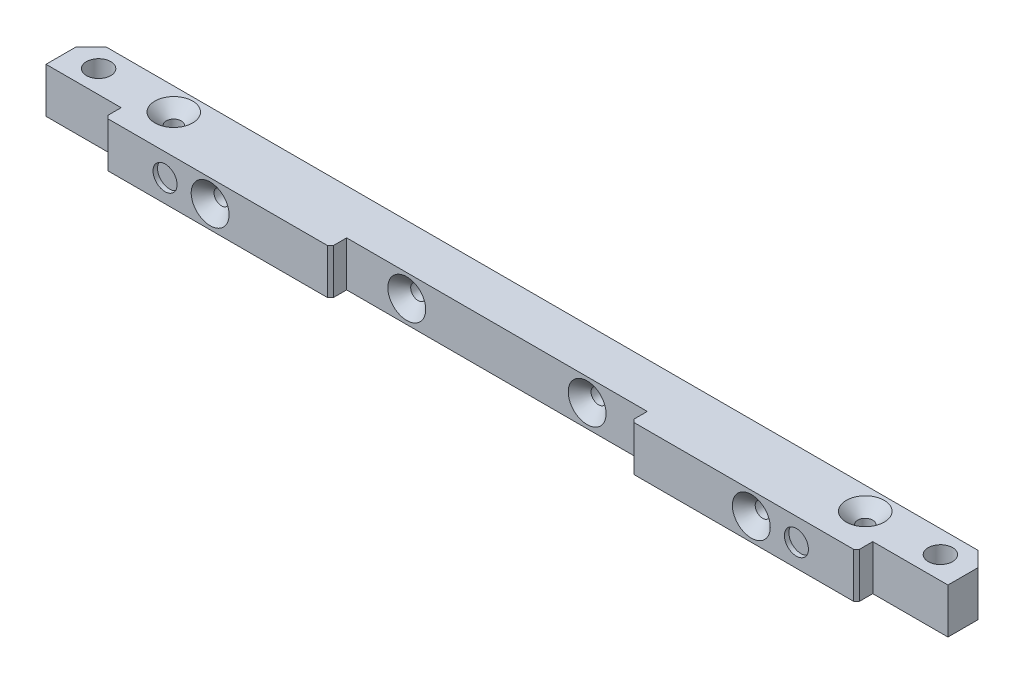
ISO-10303-21;
HEADER;
FILE_DESCRIPTION(('STEP AP214'),'2;1');
FILE_NAME('part.step','',(''),(''),'','','');
FILE_SCHEMA(('AUTOMOTIVE_DESIGN { 1 0 10303 214 1 1 1 1 }'));
ENDSEC;
DATA;
#1=APPLICATION_CONTEXT('core data for automotive mechanical design processes');
#2=APPLICATION_PROTOCOL_DEFINITION('international standard','automotive_design',2000,#1);
#3=PRODUCT_CONTEXT('',#1,'mechanical');
#4=PRODUCT('Part','Part','',(#3));
#5=PRODUCT_RELATED_PRODUCT_CATEGORY('part','',(#4));
#6=PRODUCT_DEFINITION_FORMATION('','',#4);
#7=PRODUCT_DEFINITION_CONTEXT('part definition',#1,'design');
#8=PRODUCT_DEFINITION('design','',#6,#7);
#9=PRODUCT_DEFINITION_SHAPE('','',#8);
#10=(LENGTH_UNIT() NAMED_UNIT(*) SI_UNIT(.MILLI.,.METRE.));
#11=(NAMED_UNIT(*) PLANE_ANGLE_UNIT() SI_UNIT($,.RADIAN.));
#12=(NAMED_UNIT(*) SI_UNIT($,.STERADIAN.) SOLID_ANGLE_UNIT());
#13=UNCERTAINTY_MEASURE_WITH_UNIT(LENGTH_MEASURE(1.E-05),#10,'distance_accuracy_value','');
#14=(GEOMETRIC_REPRESENTATION_CONTEXT(3) GLOBAL_UNCERTAINTY_ASSIGNED_CONTEXT((#13)) GLOBAL_UNIT_ASSIGNED_CONTEXT((#10,
#11,#12)) REPRESENTATION_CONTEXT('',''));
#15=CARTESIAN_POINT('',(0.,0.,0.));
#16=DIRECTION('',(0.,0.,1.));
#17=DIRECTION('',(1.,0.,0.));
#18=AXIS2_PLACEMENT_3D('',#15,#16,#17);
#19=CARTESIAN_POINT('',(0.,0.,12.9));
#20=DIRECTION('',(0.,0.,1.));
#21=DIRECTION('',(1.,0.,0.));
#22=AXIS2_PLACEMENT_3D('',#19,#20,#21);
#23=PLANE('',#22);
#24=CARTESIAN_POINT('',(-90.,7.50000000000002,12.9));
#25=DIRECTION('',(0.,0.,1.));
#26=DIRECTION('',(1.,0.,0.));
#27=AXIS2_PLACEMENT_3D('',#24,#25,#26);
#28=CIRCLE('',#27,6.3);
#29=CARTESIAN_POINT('',(-83.7,7.50000000000002,12.9));
#30=VERTEX_POINT('',#29);
#31=EDGE_CURVE('E687',#30,#30,#28,.T.);
#32=ORIENTED_EDGE('',*,*,#31,.F.);
#33=EDGE_LOOP('',(#32));
#34=FACE_BOUND('',#33,.T.);
#35=DIRECTION('',(1.,0.,0.));
#36=VECTOR('',#35,1.);
#37=CARTESIAN_POINT('',(-125.,0.,12.9));
#38=LINE('',#37,#36);
#39=CARTESIAN_POINT('',(-124.,0.,12.9));
#40=VERTEX_POINT('',#39);
#41=CARTESIAN_POINT('',(-51.,0.,12.9));
#42=VERTEX_POINT('',#41);
#43=EDGE_CURVE('E226',#40,#42,#38,.T.);
#44=ORIENTED_EDGE('',*,*,#43,.T.);
#45=DIRECTION('',(0.,1.,0.));
#46=VECTOR('',#45,1.);
#47=CARTESIAN_POINT('',(-51.,15.,12.9));
#48=LINE('',#47,#46);
#49=CARTESIAN_POINT('',(-51.,15.,12.9));
#50=VERTEX_POINT('',#49);
#51=EDGE_CURVE('E50',#42,#50,#48,.T.);
#52=ORIENTED_EDGE('',*,*,#51,.T.);
#53=DIRECTION('',(-1.,0.,0.));
#54=VECTOR('',#53,1.);
#55=CARTESIAN_POINT('',(-125.,15.,12.9));
#56=LINE('',#55,#54);
#57=CARTESIAN_POINT('',(-124.,15.,12.9));
#58=VERTEX_POINT('',#57);
#59=EDGE_CURVE('E229',#50,#58,#56,.T.);
#60=ORIENTED_EDGE('',*,*,#59,.T.);
#61=DIRECTION('',(0.,-1.,0.));
#62=VECTOR('',#61,1.);
#63=CARTESIAN_POINT('',(-124.,0.,12.9));
#64=LINE('',#63,#62);
#65=EDGE_CURVE('E398',#58,#40,#64,.T.);
#66=ORIENTED_EDGE('',*,*,#65,.T.);
#67=EDGE_LOOP('',(#44,#52,#60,#66));
#68=FACE_BOUND('',#67,.T.);
#69=CARTESIAN_POINT('',(-105.,7.50000000000001,12.9));
#70=DIRECTION('',(0.,0.,1.));
#71=DIRECTION('',(1.,0.,0.));
#72=AXIS2_PLACEMENT_3D('',#69,#70,#71);
#73=CIRCLE('',#72,4.00000000000001);
#74=CARTESIAN_POINT('',(-101.,7.50000000000001,12.9));
#75=VERTEX_POINT('',#74);
#76=EDGE_CURVE('E215',#75,#75,#73,.T.);
#77=ORIENTED_EDGE('',*,*,#76,.F.);
#78=EDGE_LOOP('',(#77));
#79=FACE_BOUND('',#78,.T.);
#80=ADVANCED_FACE('F41',(#34,#68,#79),#23,.T.);
#81=CARTESIAN_POINT('',(-150.,15.,7.5));
#82=DIRECTION('',(0.,0.,-1.));
#83=DIRECTION('',(-1.,0.,0.));
#84=AXIS2_PLACEMENT_3D('',#81,#82,#83);
#85=PLANE('',#84);
#86=DIRECTION('',(0.,-1.,0.));
#87=VECTOR('',#86,1.);
#88=CARTESIAN_POINT('',(-125.,15.,7.5));
#89=LINE('',#88,#87);
#90=CARTESIAN_POINT('',(-125.,15.,7.5));
#91=VERTEX_POINT('',#90);
#92=CARTESIAN_POINT('',(-125.,0.,7.5));
#93=VERTEX_POINT('',#92);
#94=EDGE_CURVE('E214',#91,#93,#89,.T.);
#95=ORIENTED_EDGE('',*,*,#94,.F.);
#96=DIRECTION('',(1.,0.,0.));
#97=VECTOR('',#96,1.);
#98=CARTESIAN_POINT('',(-150.,15.,7.5));
#99=LINE('',#98,#97);
#100=CARTESIAN_POINT('',(-150.,15.,7.5));
#101=VERTEX_POINT('',#100);
#102=EDGE_CURVE('E308',#101,#91,#99,.T.);
#103=ORIENTED_EDGE('',*,*,#102,.F.);
#104=DIRECTION('',(0.,-1.,0.));
#105=VECTOR('',#104,1.);
#106=CARTESIAN_POINT('',(-150.,15.,7.5));
#107=LINE('',#106,#105);
#108=CARTESIAN_POINT('',(-150.,0.,7.5));
#109=VERTEX_POINT('',#108);
#110=EDGE_CURVE('E330',#101,#109,#107,.T.);
#111=ORIENTED_EDGE('',*,*,#110,.T.);
#112=DIRECTION('',(1.,0.,0.));
#113=VECTOR('',#112,1.);
#114=CARTESIAN_POINT('',(-150.,0.,7.5));
#115=LINE('',#114,#113);
#116=EDGE_CURVE('E300',#109,#93,#115,.T.);
#117=ORIENTED_EDGE('',*,*,#116,.T.);
#118=EDGE_LOOP('',(#95,#103,#111,#117));
#119=FACE_BOUND('',#118,.T.);
#120=ADVANCED_FACE('F427',(#119),#85,.F.);
#121=DIRECTION('',(0.,1.,0.));
#122=VECTOR('',#121,1.);
#123=CARTESIAN_POINT('',(125.,15.,7.5));
#124=LINE('',#123,#122);
#125=CARTESIAN_POINT('',(125.,0.,7.5));
#126=VERTEX_POINT('',#125);
#127=CARTESIAN_POINT('',(125.,15.,7.5));
#128=VERTEX_POINT('',#127);
#129=EDGE_CURVE('E238',#126,#128,#124,.T.);
#130=ORIENTED_EDGE('',*,*,#129,.F.);
#131=CARTESIAN_POINT('',(150.,0.,7.5));
#132=VERTEX_POINT('',#131);
#133=EDGE_CURVE('E323',#126,#132,#115,.T.);
#134=ORIENTED_EDGE('',*,*,#133,.T.);
#135=DIRECTION('',(0.,-1.,0.));
#136=VECTOR('',#135,1.);
#137=CARTESIAN_POINT('',(150.,15.,7.5));
#138=LINE('',#137,#136);
#139=CARTESIAN_POINT('',(150.,15.,7.5));
#140=VERTEX_POINT('',#139);
#141=EDGE_CURVE('E312',#140,#132,#138,.T.);
#142=ORIENTED_EDGE('',*,*,#141,.F.);
#143=EDGE_CURVE('E307',#128,#140,#99,.T.);
#144=ORIENTED_EDGE('',*,*,#143,.F.);
#145=EDGE_LOOP('',(#130,#134,#142,#144));
#146=FACE_BOUND('',#145,.T.);
#147=ADVANCED_FACE('F434',(#146),#85,.F.);
#148=CARTESIAN_POINT('',(150.,15.,-7.5));
#149=DIRECTION('',(-1.,0.,0.));
#150=DIRECTION('',(0.,0.,1.));
#151=AXIS2_PLACEMENT_3D('',#148,#149,#150);
#152=PLANE('',#151);
#153=DIRECTION('',(0.,0.,-1.));
#154=VECTOR('',#153,1.);
#155=CARTESIAN_POINT('',(150.,0.,-7.5));
#156=LINE('',#155,#154);
#157=CARTESIAN_POINT('',(150.,0.,-2.5));
#158=VERTEX_POINT('',#157);
#159=EDGE_CURVE('E294',#132,#158,#156,.T.);
#160=ORIENTED_EDGE('',*,*,#159,.T.);
#161=DIRECTION('',(0.,1.,0.));
#162=VECTOR('',#161,1.);
#163=CARTESIAN_POINT('',(150.,15.,-2.5));
#164=LINE('',#163,#162);
#165=CARTESIAN_POINT('',(150.,15.,-2.5));
#166=VERTEX_POINT('',#165);
#167=EDGE_CURVE('E347',#158,#166,#164,.T.);
#168=ORIENTED_EDGE('',*,*,#167,.T.);
#169=DIRECTION('',(0.,0.,-1.));
#170=VECTOR('',#169,1.);
#171=CARTESIAN_POINT('',(150.,15.,-7.5));
#172=LINE('',#171,#170);
#173=EDGE_CURVE('E295',#140,#166,#172,.T.);
#174=ORIENTED_EDGE('',*,*,#173,.F.);
#175=ORIENTED_EDGE('',*,*,#141,.T.);
#176=EDGE_LOOP('',(#160,#168,#174,#175));
#177=FACE_BOUND('',#176,.T.);
#178=ADVANCED_FACE('F727',(#177),#152,.F.);
#179=CARTESIAN_POINT('',(-150.,15.,-7.5));
#180=DIRECTION('',(0.,0.,1.));
#181=DIRECTION('',(1.,0.,0.));
#182=AXIS2_PLACEMENT_3D('',#179,#180,#181);
#183=PLANE('',#182);
#184=CARTESIAN_POINT('',(-30.,7.50000000000003,-7.5));
#185=DIRECTION('',(0.,0.,1.));
#186=DIRECTION('',(1.,0.,0.));
#187=AXIS2_PLACEMENT_3D('',#184,#185,#186);
#188=CIRCLE('',#187,2.5);
#189=CARTESIAN_POINT('',(-27.5,7.50000000000003,-7.5));
#190=VERTEX_POINT('',#189);
#191=EDGE_CURVE('E703',#190,#190,#188,.T.);
#192=ORIENTED_EDGE('',*,*,#191,.T.);
#193=EDGE_LOOP('',(#192));
#194=FACE_BOUND('',#193,.T.);
#195=CARTESIAN_POINT('',(30.,7.50000000000003,-7.5));
#196=DIRECTION('',(0.,0.,1.));
#197=DIRECTION('',(1.,0.,0.));
#198=AXIS2_PLACEMENT_3D('',#195,#196,#197);
#199=CIRCLE('',#198,2.5);
#200=CARTESIAN_POINT('',(32.5,7.50000000000003,-7.5));
#201=VERTEX_POINT('',#200);
#202=EDGE_CURVE('E691',#201,#201,#199,.T.);
#203=ORIENTED_EDGE('',*,*,#202,.T.);
#204=EDGE_LOOP('',(#203));
#205=FACE_BOUND('',#204,.T.);
#206=CARTESIAN_POINT('',(-90.,7.50000000000002,-7.5));
#207=DIRECTION('',(0.,0.,1.));
#208=DIRECTION('',(1.,0.,0.));
#209=AXIS2_PLACEMENT_3D('',#206,#207,#208);
#210=CIRCLE('',#209,2.49999999999999);
#211=CARTESIAN_POINT('',(-87.5,7.50000000000002,-7.5));
#212=VERTEX_POINT('',#211);
#213=EDGE_CURVE('E677',#212,#212,#210,.T.);
#214=ORIENTED_EDGE('',*,*,#213,.T.);
#215=EDGE_LOOP('',(#214));
#216=FACE_BOUND('',#215,.T.);
#217=CARTESIAN_POINT('',(90.,7.50000000000004,-7.5));
#218=DIRECTION('',(0.,0.,1.));
#219=DIRECTION('',(1.,0.,0.));
#220=AXIS2_PLACEMENT_3D('',#217,#218,#219);
#221=CIRCLE('',#220,2.49999999999999);
#222=CARTESIAN_POINT('',(92.5,7.50000000000004,-7.5));
#223=VERTEX_POINT('',#222);
#224=EDGE_CURVE('E186',#223,#223,#221,.T.);
#225=ORIENTED_EDGE('',*,*,#224,.T.);
#226=EDGE_LOOP('',(#225));
#227=FACE_BOUND('',#226,.T.);
#228=DIRECTION('',(-1.,0.,0.));
#229=VECTOR('',#228,1.);
#230=CARTESIAN_POINT('',(-150.,15.,-7.5));
#231=LINE('',#230,#229);
#232=CARTESIAN_POINT('',(145.,15.,-7.5));
#233=VERTEX_POINT('',#232);
#234=CARTESIAN_POINT('',(-145.,15.,-7.5));
#235=VERTEX_POINT('',#234);
#236=EDGE_CURVE('E299',#233,#235,#231,.T.);
#237=ORIENTED_EDGE('',*,*,#236,.F.);
#238=DIRECTION('',(0.,-1.,0.));
#239=VECTOR('',#238,1.);
#240=CARTESIAN_POINT('',(145.,15.,-7.5));
#241=LINE('',#240,#239);
#242=CARTESIAN_POINT('',(145.,0.,-7.5));
#243=VERTEX_POINT('',#242);
#244=EDGE_CURVE('E337',#233,#243,#241,.T.);
#245=ORIENTED_EDGE('',*,*,#244,.T.);
#246=DIRECTION('',(-1.,0.,0.));
#247=VECTOR('',#246,1.);
#248=CARTESIAN_POINT('',(-150.,0.,-7.5));
#249=LINE('',#248,#247);
#250=CARTESIAN_POINT('',(-145.,0.,-7.5));
#251=VERTEX_POINT('',#250);
#252=EDGE_CURVE('E316',#243,#251,#249,.T.);
#253=ORIENTED_EDGE('',*,*,#252,.T.);
#254=DIRECTION('',(0.,1.,0.));
#255=VECTOR('',#254,1.);
#256=CARTESIAN_POINT('',(-145.,15.,-7.5));
#257=LINE('',#256,#255);
#258=EDGE_CURVE('E334',#251,#235,#257,.T.);
#259=ORIENTED_EDGE('',*,*,#258,.T.);
#260=EDGE_LOOP('',(#237,#245,#253,#259));
#261=FACE_BOUND('',#260,.T.);
#262=ADVANCED_FACE('F723',(#194,#205,#216,#227,#261),#183,.F.);
#263=CARTESIAN_POINT('',(-150.,15.,-7.5));
#264=DIRECTION('',(1.,0.,0.));
#265=DIRECTION('',(0.,0.,-1.));
#266=AXIS2_PLACEMENT_3D('',#263,#264,#265);
#267=PLANE('',#266);
#268=DIRECTION('',(0.,0.,1.));
#269=VECTOR('',#268,1.);
#270=CARTESIAN_POINT('',(-150.,15.,-7.5));
#271=LINE('',#270,#269);
#272=CARTESIAN_POINT('',(-150.,15.,-2.5));
#273=VERTEX_POINT('',#272);
#274=EDGE_CURVE('E304',#273,#101,#271,.T.);
#275=ORIENTED_EDGE('',*,*,#274,.F.);
#276=DIRECTION('',(0.,-1.,0.));
#277=VECTOR('',#276,1.);
#278=CARTESIAN_POINT('',(-150.,15.,-2.5));
#279=LINE('',#278,#277);
#280=CARTESIAN_POINT('',(-150.,0.,-2.5));
#281=VERTEX_POINT('',#280);
#282=EDGE_CURVE('E356',#273,#281,#279,.T.);
#283=ORIENTED_EDGE('',*,*,#282,.T.);
#284=DIRECTION('',(0.,0.,1.));
#285=VECTOR('',#284,1.);
#286=CARTESIAN_POINT('',(-150.,0.,-7.5));
#287=LINE('',#286,#285);
#288=EDGE_CURVE('E320',#281,#109,#287,.T.);
#289=ORIENTED_EDGE('',*,*,#288,.T.);
#290=ORIENTED_EDGE('',*,*,#110,.F.);
#291=EDGE_LOOP('',(#275,#283,#289,#290));
#292=FACE_BOUND('',#291,.T.);
#293=ADVANCED_FACE('F726',(#292),#267,.F.);
#294=CARTESIAN_POINT('',(0.,15.,0.));
#295=DIRECTION('',(0.,1.,0.));
#296=DIRECTION('',(0.,0.,1.));
#297=AXIS2_PLACEMENT_3D('',#294,#295,#296);
#298=PLANE('',#297);
#299=CARTESIAN_POINT('',(124.,15.,12.9));
#300=VERTEX_POINT('',#299);
#301=CARTESIAN_POINT('',(51.,15.,12.9));
#302=VERTEX_POINT('',#301);
#303=EDGE_CURVE('E234',#300,#302,#56,.T.);
#304=ORIENTED_EDGE('',*,*,#303,.F.);
#305=DIRECTION('',(0.707106781186548,0.,-0.707106781186548));
#306=VECTOR('',#305,1.);
#307=CARTESIAN_POINT('',(68.45,15.,68.45));
#308=LINE('',#307,#306);
#309=CARTESIAN_POINT('',(125.,15.,11.9));
#310=VERTEX_POINT('',#309);
#311=EDGE_CURVE('E376',#300,#310,#308,.T.);
#312=ORIENTED_EDGE('',*,*,#311,.T.);
#313=DIRECTION('',(0.,0.,-1.));
#314=VECTOR('',#313,1.);
#315=CARTESIAN_POINT('',(125.,15.,12.9));
#316=LINE('',#315,#314);
#317=EDGE_CURVE('E245',#310,#128,#316,.T.);
#318=ORIENTED_EDGE('',*,*,#317,.T.);
#319=ORIENTED_EDGE('',*,*,#143,.T.);
#320=ORIENTED_EDGE('',*,*,#173,.T.);
#321=DIRECTION('',(0.707106781186544,0.,0.707106781186551));
#322=VECTOR('',#321,1.);
#323=CARTESIAN_POINT('',(76.2500000000008,15.,-76.25));
#324=LINE('',#323,#322);
#325=EDGE_CURVE('E353',#166,#233,#324,.F.);
#326=ORIENTED_EDGE('',*,*,#325,.T.);
#327=ORIENTED_EDGE('',*,*,#236,.T.);
#328=DIRECTION('',(0.707106781186549,0.,-0.707106781186546));
#329=VECTOR('',#328,1.);
#330=CARTESIAN_POINT('',(-76.2499999999996,15.,-76.25));
#331=LINE('',#330,#329);
#332=EDGE_CURVE('E350',#235,#273,#331,.F.);
#333=ORIENTED_EDGE('',*,*,#332,.T.);
#334=ORIENTED_EDGE('',*,*,#274,.T.);
#335=ORIENTED_EDGE('',*,*,#102,.T.);
#336=DIRECTION('',(0.,0.,-1.));
#337=VECTOR('',#336,1.);
#338=CARTESIAN_POINT('',(-125.,15.,12.9));
#339=LINE('',#338,#337);
#340=CARTESIAN_POINT('',(-125.,15.,11.9));
#341=VERTEX_POINT('',#340);
#342=EDGE_CURVE('E242',#341,#91,#339,.T.);
#343=ORIENTED_EDGE('',*,*,#342,.F.);
#344=DIRECTION('',(0.707106781186548,0.,0.707106781186548));
#345=VECTOR('',#344,1.);
#346=CARTESIAN_POINT('',(-68.45,15.,68.45));
#347=LINE('',#346,#345);
#348=EDGE_CURVE('E367',#341,#58,#347,.T.);
#349=ORIENTED_EDGE('',*,*,#348,.T.);
#350=ORIENTED_EDGE('',*,*,#59,.F.);
#351=DIRECTION('',(0.707106781186548,0.,-0.707106781186548));
#352=VECTOR('',#351,1.);
#353=CARTESIAN_POINT('',(-19.05,15.,-19.05));
#354=LINE('',#353,#352);
#355=CARTESIAN_POINT('',(-50.,15.,11.9));
#356=VERTEX_POINT('',#355);
#357=EDGE_CURVE('E370',#50,#356,#354,.T.);
#358=ORIENTED_EDGE('',*,*,#357,.T.);
#359=DIRECTION('',(0.,0.,1.));
#360=VECTOR('',#359,1.);
#361=CARTESIAN_POINT('',(-50.,15.,7.5));
#362=LINE('',#361,#360);
#363=CARTESIAN_POINT('',(-50.,15.,7.5));
#364=VERTEX_POINT('',#363);
#365=EDGE_CURVE('E200',#364,#356,#362,.T.);
#366=ORIENTED_EDGE('',*,*,#365,.F.);
#367=DIRECTION('',(-1.,0.,0.));
#368=VECTOR('',#367,1.);
#369=CARTESIAN_POINT('',(-50.,15.,7.5));
#370=LINE('',#369,#368);
#371=CARTESIAN_POINT('',(50.,15.,7.5));
#372=VERTEX_POINT('',#371);
#373=EDGE_CURVE('E175',#372,#364,#370,.T.);
#374=ORIENTED_EDGE('',*,*,#373,.F.);
#375=DIRECTION('',(0.,0.,1.));
#376=VECTOR('',#375,1.);
#377=CARTESIAN_POINT('',(50.,15.,7.5));
#378=LINE('',#377,#376);
#379=CARTESIAN_POINT('',(50.,15.,11.9));
#380=VERTEX_POINT('',#379);
#381=EDGE_CURVE('E204',#372,#380,#378,.T.);
#382=ORIENTED_EDGE('',*,*,#381,.T.);
#383=DIRECTION('',(0.707106781186548,0.,0.707106781186548));
#384=VECTOR('',#383,1.);
#385=CARTESIAN_POINT('',(19.05,15.,-19.05));
#386=LINE('',#385,#384);
#387=EDGE_CURVE('E373',#380,#302,#386,.T.);
#388=ORIENTED_EDGE('',*,*,#387,.T.);
#389=EDGE_LOOP('',(#304,#312,#318,#319,#320,#326,#327,#333,#334,#335,#343,#349,#350,#358,#366,
#374,#382,#388));
#390=FACE_BOUND('',#389,.T.);
#391=CARTESIAN_POINT('',(-140.,15.,0.));
#392=DIRECTION('',(0.,1.,0.));
#393=DIRECTION('',(0.,0.,1.));
#394=AXIS2_PLACEMENT_3D('',#391,#392,#393);
#395=CIRCLE('',#394,4.05);
#396=CARTESIAN_POINT('',(-140.,15.,4.05));
#397=VERTEX_POINT('',#396);
#398=EDGE_CURVE('E254',#397,#397,#395,.T.);
#399=ORIENTED_EDGE('',*,*,#398,.F.);
#400=EDGE_LOOP('',(#399));
#401=FACE_BOUND('',#400,.T.);
#402=CARTESIAN_POINT('',(140.,15.,0.));
#403=DIRECTION('',(0.,1.,0.));
#404=DIRECTION('',(0.,0.,1.));
#405=AXIS2_PLACEMENT_3D('',#402,#403,#404);
#406=CIRCLE('',#405,4.05);
#407=CARTESIAN_POINT('',(140.,15.,4.05));
#408=VERTEX_POINT('',#407);
#409=EDGE_CURVE('E262',#408,#408,#406,.T.);
#410=ORIENTED_EDGE('',*,*,#409,.F.);
#411=EDGE_LOOP('',(#410));
#412=FACE_BOUND('',#411,.T.);
#413=CARTESIAN_POINT('',(-115.,15.,0.));
#414=DIRECTION('',(0.,1.,0.));
#415=DIRECTION('',(0.,0.,1.));
#416=AXIS2_PLACEMENT_3D('',#413,#414,#415);
#417=CIRCLE('',#416,6.3);
#418=CARTESIAN_POINT('',(-115.,15.,6.3));
#419=VERTEX_POINT('',#418);
#420=EDGE_CURVE('E270',#419,#419,#417,.T.);
#421=ORIENTED_EDGE('',*,*,#420,.F.);
#422=EDGE_LOOP('',(#421));
#423=FACE_BOUND('',#422,.T.);
#424=CARTESIAN_POINT('',(115.,15.,0.));
#425=DIRECTION('',(0.,1.,0.));
#426=DIRECTION('',(0.,0.,1.));
#427=AXIS2_PLACEMENT_3D('',#424,#425,#426);
#428=CIRCLE('',#427,6.3);
#429=CARTESIAN_POINT('',(115.,15.,6.3));
#430=VERTEX_POINT('',#429);
#431=EDGE_CURVE('E282',#430,#430,#428,.T.);
#432=ORIENTED_EDGE('',*,*,#431,.F.);
#433=EDGE_LOOP('',(#432));
#434=FACE_BOUND('',#433,.T.);
#435=ADVANCED_FACE('F411',(#390,#401,#412,#423,#434),#298,.T.);
#436=CARTESIAN_POINT('',(0.,0.,0.));
#437=DIRECTION('',(0.,1.,0.));
#438=DIRECTION('',(0.,0.,1.));
#439=AXIS2_PLACEMENT_3D('',#436,#437,#438);
#440=PLANE('',#439);
#441=CARTESIAN_POINT('',(-140.,0.,0.));
#442=DIRECTION('',(0.,1.,0.));
#443=DIRECTION('',(0.,0.,1.));
#444=AXIS2_PLACEMENT_3D('',#441,#442,#443);
#445=CIRCLE('',#444,4.05);
#446=CARTESIAN_POINT('',(-140.,0.,4.05));
#447=VERTEX_POINT('',#446);
#448=EDGE_CURVE('E258',#447,#447,#445,.T.);
#449=ORIENTED_EDGE('',*,*,#448,.T.);
#450=EDGE_LOOP('',(#449));
#451=FACE_BOUND('',#450,.T.);
#452=CARTESIAN_POINT('',(140.,0.,0.));
#453=DIRECTION('',(0.,1.,0.));
#454=DIRECTION('',(0.,0.,1.));
#455=AXIS2_PLACEMENT_3D('',#452,#453,#454);
#456=CIRCLE('',#455,4.05);
#457=CARTESIAN_POINT('',(140.,0.,4.05));
#458=VERTEX_POINT('',#457);
#459=EDGE_CURVE('E266',#458,#458,#456,.T.);
#460=ORIENTED_EDGE('',*,*,#459,.T.);
#461=EDGE_LOOP('',(#460));
#462=FACE_BOUND('',#461,.T.);
#463=CARTESIAN_POINT('',(-115.,0.,0.));
#464=DIRECTION('',(0.,1.,0.));
#465=DIRECTION('',(0.,0.,1.));
#466=AXIS2_PLACEMENT_3D('',#463,#464,#465);
#467=CIRCLE('',#466,2.5);
#468=CARTESIAN_POINT('',(-115.,0.,2.5));
#469=VERTEX_POINT('',#468);
#470=EDGE_CURVE('E278',#469,#469,#467,.T.);
#471=ORIENTED_EDGE('',*,*,#470,.T.);
#472=EDGE_LOOP('',(#471));
#473=FACE_BOUND('',#472,.T.);
#474=CARTESIAN_POINT('',(115.,0.,0.));
#475=DIRECTION('',(0.,1.,0.));
#476=DIRECTION('',(0.,0.,1.));
#477=AXIS2_PLACEMENT_3D('',#474,#475,#476);
#478=CIRCLE('',#477,2.5);
#479=CARTESIAN_POINT('',(115.,0.,2.5));
#480=VERTEX_POINT('',#479);
#481=EDGE_CURVE('E290',#480,#480,#478,.T.);
#482=ORIENTED_EDGE('',*,*,#481,.T.);
#483=EDGE_LOOP('',(#482));
#484=FACE_BOUND('',#483,.T.);
#485=DIRECTION('',(0.,0.,-1.));
#486=VECTOR('',#485,1.);
#487=CARTESIAN_POINT('',(125.,0.,12.9));
#488=LINE('',#487,#486);
#489=CARTESIAN_POINT('',(125.,0.,11.9));
#490=VERTEX_POINT('',#489);
#491=EDGE_CURVE('E248',#490,#126,#488,.T.);
#492=ORIENTED_EDGE('',*,*,#491,.F.);
#493=DIRECTION('',(-0.707106781186548,0.,0.707106781186548));
#494=VECTOR('',#493,1.);
#495=CARTESIAN_POINT('',(124.,0.,12.9));
#496=LINE('',#495,#494);
#497=CARTESIAN_POINT('',(124.,0.,12.9));
#498=VERTEX_POINT('',#497);
#499=EDGE_CURVE('E389',#490,#498,#496,.T.);
#500=ORIENTED_EDGE('',*,*,#499,.T.);
#501=CARTESIAN_POINT('',(51.,0.,12.9));
#502=VERTEX_POINT('',#501);
#503=EDGE_CURVE('E230',#502,#498,#38,.T.);
#504=ORIENTED_EDGE('',*,*,#503,.F.);
#505=DIRECTION('',(-0.707106781186548,0.,-0.707106781186548));
#506=VECTOR('',#505,1.);
#507=CARTESIAN_POINT('',(50.,0.,11.9));
#508=LINE('',#507,#506);
#509=CARTESIAN_POINT('',(50.,0.,11.9));
#510=VERTEX_POINT('',#509);
#511=EDGE_CURVE('E386',#502,#510,#508,.T.);
#512=ORIENTED_EDGE('',*,*,#511,.T.);
#513=DIRECTION('',(0.,0.,1.));
#514=VECTOR('',#513,1.);
#515=CARTESIAN_POINT('',(50.,0.,7.5));
#516=LINE('',#515,#514);
#517=CARTESIAN_POINT('',(50.,0.,7.5));
#518=VERTEX_POINT('',#517);
#519=EDGE_CURVE('E174',#518,#510,#516,.T.);
#520=ORIENTED_EDGE('',*,*,#519,.F.);
#521=DIRECTION('',(1.,0.,0.));
#522=VECTOR('',#521,1.);
#523=CARTESIAN_POINT('',(-50.,0.,7.5));
#524=LINE('',#523,#522);
#525=CARTESIAN_POINT('',(-50.,0.,7.5));
#526=VERTEX_POINT('',#525);
#527=EDGE_CURVE('E181',#526,#518,#524,.T.);
#528=ORIENTED_EDGE('',*,*,#527,.F.);
#529=DIRECTION('',(0.,0.,1.));
#530=VECTOR('',#529,1.);
#531=CARTESIAN_POINT('',(-50.,0.,7.5));
#532=LINE('',#531,#530);
#533=CARTESIAN_POINT('',(-50.,0.,11.9));
#534=VERTEX_POINT('',#533);
#535=EDGE_CURVE('E164',#526,#534,#532,.T.);
#536=ORIENTED_EDGE('',*,*,#535,.T.);
#537=DIRECTION('',(-0.707106781186548,0.,0.707106781186548));
#538=VECTOR('',#537,1.);
#539=CARTESIAN_POINT('',(-50.,0.,11.9));
#540=LINE('',#539,#538);
#541=EDGE_CURVE('E63',#534,#42,#540,.T.);
#542=ORIENTED_EDGE('',*,*,#541,.T.);
#543=ORIENTED_EDGE('',*,*,#43,.F.);
#544=DIRECTION('',(-0.707106781186548,0.,-0.707106781186548));
#545=VECTOR('',#544,1.);
#546=CARTESIAN_POINT('',(-124.,0.,12.9));
#547=LINE('',#546,#545);
#548=CARTESIAN_POINT('',(-125.,0.,11.9));
#549=VERTEX_POINT('',#548);
#550=EDGE_CURVE('E57',#40,#549,#547,.T.);
#551=ORIENTED_EDGE('',*,*,#550,.T.);
#552=DIRECTION('',(0.,0.,-1.));
#553=VECTOR('',#552,1.);
#554=CARTESIAN_POINT('',(-125.,0.,12.9));
#555=LINE('',#554,#553);
#556=EDGE_CURVE('E251',#549,#93,#555,.T.);
#557=ORIENTED_EDGE('',*,*,#556,.T.);
#558=ORIENTED_EDGE('',*,*,#116,.F.);
#559=ORIENTED_EDGE('',*,*,#288,.F.);
#560=DIRECTION('',(-0.707106781186549,0.,0.707106781186546));
#561=VECTOR('',#560,1.);
#562=CARTESIAN_POINT('',(-150.,0.,-2.5));
#563=LINE('',#562,#561);
#564=EDGE_CURVE('E341',#281,#251,#563,.F.);
#565=ORIENTED_EDGE('',*,*,#564,.T.);
#566=ORIENTED_EDGE('',*,*,#252,.F.);
#567=DIRECTION('',(-0.707106781186544,0.,-0.707106781186551));
#568=VECTOR('',#567,1.);
#569=CARTESIAN_POINT('',(145.,0.,-7.5));
#570=LINE('',#569,#568);
#571=EDGE_CURVE('E344',#243,#158,#570,.F.);
#572=ORIENTED_EDGE('',*,*,#571,.T.);
#573=ORIENTED_EDGE('',*,*,#159,.F.);
#574=ORIENTED_EDGE('',*,*,#133,.F.);
#575=EDGE_LOOP('',(#492,#500,#504,#512,#520,#528,#536,#542,#543,#551,#557,#558,#559,#565,#566,
#572,#573,#574));
#576=FACE_BOUND('',#575,.T.);
#577=ADVANCED_FACE('F189',(#451,#462,#473,#484,#576),#440,.F.);
#578=CARTESIAN_POINT('',(115.,15.,0.));
#579=DIRECTION('',(0.,1.,0.));
#580=DIRECTION('',(0.,0.,1.));
#581=AXIS2_PLACEMENT_3D('',#578,#579,#580);
#582=CYLINDRICAL_SURFACE('',#581,2.5);
#583=ORIENTED_EDGE('',*,*,#481,.F.);
#584=EDGE_LOOP('',(#583));
#585=FACE_BOUND('',#584,.T.);
#586=CARTESIAN_POINT('',(115.,11.2,0.));
#587=DIRECTION('',(0.,1.,0.));
#588=DIRECTION('',(0.,0.,1.));
#589=AXIS2_PLACEMENT_3D('',#586,#587,#588);
#590=CIRCLE('',#589,2.5);
#591=CARTESIAN_POINT('',(115.,11.2,2.5));
#592=VERTEX_POINT('',#591);
#593=EDGE_CURVE('E286',#592,#592,#590,.T.);
#594=ORIENTED_EDGE('',*,*,#593,.T.);
#595=EDGE_LOOP('',(#594));
#596=FACE_BOUND('',#595,.T.);
#597=ADVANCED_FACE('F754',(#585,#596),#582,.F.);
#598=CARTESIAN_POINT('',(115.,15.,0.));
#599=DIRECTION('',(0.,1.,0.));
#600=DIRECTION('',(0.,0.,1.));
#601=AXIS2_PLACEMENT_3D('',#598,#599,#600);
#602=CONICAL_SURFACE('',#601,6.3,0.785398163397448);
#603=ORIENTED_EDGE('',*,*,#593,.F.);
#604=EDGE_LOOP('',(#603));
#605=FACE_BOUND('',#604,.T.);
#606=ORIENTED_EDGE('',*,*,#431,.T.);
#607=EDGE_LOOP('',(#606));
#608=FACE_BOUND('',#607,.T.);
#609=ADVANCED_FACE('F760',(#605,#608),#602,.F.);
#610=CARTESIAN_POINT('',(-115.,15.,0.));
#611=DIRECTION('',(0.,1.,0.));
#612=DIRECTION('',(0.,0.,1.));
#613=AXIS2_PLACEMENT_3D('',#610,#611,#612);
#614=CYLINDRICAL_SURFACE('',#613,2.5);
#615=ORIENTED_EDGE('',*,*,#470,.F.);
#616=EDGE_LOOP('',(#615));
#617=FACE_BOUND('',#616,.T.);
#618=CARTESIAN_POINT('',(-115.,11.2,0.));
#619=DIRECTION('',(0.,1.,0.));
#620=DIRECTION('',(0.,0.,1.));
#621=AXIS2_PLACEMENT_3D('',#618,#619,#620);
#622=CIRCLE('',#621,2.5);
#623=CARTESIAN_POINT('',(-115.,11.2,2.5));
#624=VERTEX_POINT('',#623);
#625=EDGE_CURVE('E274',#624,#624,#622,.T.);
#626=ORIENTED_EDGE('',*,*,#625,.T.);
#627=EDGE_LOOP('',(#626));
#628=FACE_BOUND('',#627,.T.);
#629=ADVANCED_FACE('F764',(#617,#628),#614,.F.);
#630=CARTESIAN_POINT('',(-115.,15.,0.));
#631=DIRECTION('',(0.,1.,0.));
#632=DIRECTION('',(0.,0.,1.));
#633=AXIS2_PLACEMENT_3D('',#630,#631,#632);
#634=CONICAL_SURFACE('',#633,6.3,0.785398163397448);
#635=ORIENTED_EDGE('',*,*,#625,.F.);
#636=EDGE_LOOP('',(#635));
#637=FACE_BOUND('',#636,.T.);
#638=ORIENTED_EDGE('',*,*,#420,.T.);
#639=EDGE_LOOP('',(#638));
#640=FACE_BOUND('',#639,.T.);
#641=ADVANCED_FACE('F768',(#637,#640),#634,.F.);
#642=CARTESIAN_POINT('',(140.,15.,0.));
#643=DIRECTION('',(0.,1.,0.));
#644=DIRECTION('',(0.,0.,1.));
#645=AXIS2_PLACEMENT_3D('',#642,#643,#644);
#646=CYLINDRICAL_SURFACE('',#645,4.05);
#647=ORIENTED_EDGE('',*,*,#459,.F.);
#648=EDGE_LOOP('',(#647));
#649=FACE_BOUND('',#648,.T.);
#650=ORIENTED_EDGE('',*,*,#409,.T.);
#651=EDGE_LOOP('',(#650));
#652=FACE_BOUND('',#651,.T.);
#653=ADVANCED_FACE('F772',(#649,#652),#646,.F.);
#654=CARTESIAN_POINT('',(-140.,15.,0.));
#655=DIRECTION('',(0.,1.,0.));
#656=DIRECTION('',(0.,0.,1.));
#657=AXIS2_PLACEMENT_3D('',#654,#655,#656);
#658=CYLINDRICAL_SURFACE('',#657,4.05);
#659=ORIENTED_EDGE('',*,*,#448,.F.);
#660=EDGE_LOOP('',(#659));
#661=FACE_BOUND('',#660,.T.);
#662=ORIENTED_EDGE('',*,*,#398,.T.);
#663=EDGE_LOOP('',(#662));
#664=FACE_BOUND('',#663,.T.);
#665=ADVANCED_FACE('F776',(#661,#664),#658,.F.);
#666=CARTESIAN_POINT('',(-125.,15.,12.9));
#667=DIRECTION('',(1.,0.,0.));
#668=DIRECTION('',(0.,0.,-1.));
#669=AXIS2_PLACEMENT_3D('',#666,#667,#668);
#670=PLANE('',#669);
#671=ORIENTED_EDGE('',*,*,#556,.F.);
#672=DIRECTION('',(0.,1.,0.));
#673=VECTOR('',#672,1.);
#674=CARTESIAN_POINT('',(-125.,15.,11.9));
#675=LINE('',#674,#673);
#676=EDGE_CURVE('E11',#549,#341,#675,.T.);
#677=ORIENTED_EDGE('',*,*,#676,.T.);
#678=ORIENTED_EDGE('',*,*,#342,.T.);
#679=ORIENTED_EDGE('',*,*,#94,.T.);
#680=EDGE_LOOP('',(#671,#677,#678,#679));
#681=FACE_BOUND('',#680,.T.);
#682=ADVANCED_FACE('F450',(#681),#670,.F.);
#683=CARTESIAN_POINT('',(125.,15.,12.9));
#684=DIRECTION('',(-1.,0.,0.));
#685=DIRECTION('',(0.,0.,1.));
#686=AXIS2_PLACEMENT_3D('',#683,#684,#685);
#687=PLANE('',#686);
#688=ORIENTED_EDGE('',*,*,#317,.F.);
#689=DIRECTION('',(0.,-1.,0.));
#690=VECTOR('',#689,1.);
#691=CARTESIAN_POINT('',(125.,0.,11.9));
#692=LINE('',#691,#690);
#693=EDGE_CURVE('E379',#310,#490,#692,.T.);
#694=ORIENTED_EDGE('',*,*,#693,.T.);
#695=ORIENTED_EDGE('',*,*,#491,.T.);
#696=ORIENTED_EDGE('',*,*,#129,.T.);
#697=EDGE_LOOP('',(#688,#694,#695,#696));
#698=FACE_BOUND('',#697,.T.);
#699=ADVANCED_FACE('F442',(#698),#687,.F.);
#700=CARTESIAN_POINT('',(90.,7.50000000000004,12.9));
#701=DIRECTION('',(0.,0.,1.));
#702=DIRECTION('',(1.,0.,0.));
#703=AXIS2_PLACEMENT_3D('',#700,#701,#702);
#704=CIRCLE('',#703,6.3);
#705=CARTESIAN_POINT('',(96.3,7.50000000000004,12.9));
#706=VERTEX_POINT('',#705);
#707=EDGE_CURVE('E455',#706,#706,#704,.T.);
#708=ORIENTED_EDGE('',*,*,#707,.F.);
#709=EDGE_LOOP('',(#708));
#710=FACE_BOUND('',#709,.T.);
#711=ORIENTED_EDGE('',*,*,#503,.T.);
#712=DIRECTION('',(0.,1.,0.));
#713=VECTOR('',#712,1.);
#714=CARTESIAN_POINT('',(124.,15.,12.9));
#715=LINE('',#714,#713);
#716=EDGE_CURVE('E363',#498,#300,#715,.T.);
#717=ORIENTED_EDGE('',*,*,#716,.T.);
#718=ORIENTED_EDGE('',*,*,#303,.T.);
#719=DIRECTION('',(0.,-1.,0.));
#720=VECTOR('',#719,1.);
#721=CARTESIAN_POINT('',(51.,0.,12.9));
#722=LINE('',#721,#720);
#723=EDGE_CURVE('E360',#302,#502,#722,.T.);
#724=ORIENTED_EDGE('',*,*,#723,.T.);
#725=EDGE_LOOP('',(#711,#717,#718,#724));
#726=FACE_BOUND('',#725,.T.);
#727=CARTESIAN_POINT('',(105.,7.50000000000005,12.9));
#728=DIRECTION('',(0.,0.,1.));
#729=DIRECTION('',(1.,0.,0.));
#730=AXIS2_PLACEMENT_3D('',#727,#728,#729);
#731=CIRCLE('',#730,4.00000000000001);
#732=CARTESIAN_POINT('',(109.,7.50000000000005,12.9));
#733=VERTEX_POINT('',#732);
#734=EDGE_CURVE('E203',#733,#733,#731,.T.);
#735=ORIENTED_EDGE('',*,*,#734,.F.);
#736=EDGE_LOOP('',(#735));
#737=FACE_BOUND('',#736,.T.);
#738=ADVANCED_FACE('F430',(#710,#726,#737),#23,.T.);
#739=CARTESIAN_POINT('',(105.,7.50000000000005,11.4));
#740=DIRECTION('',(0.,0.,1.));
#741=DIRECTION('',(1.,0.,0.));
#742=AXIS2_PLACEMENT_3D('',#739,#740,#741);
#743=CYLINDRICAL_SURFACE('',#742,4.00000000000001);
#744=CARTESIAN_POINT('',(105.,7.50000000000005,11.4));
#745=DIRECTION('',(0.,0.,1.));
#746=DIRECTION('',(1.,0.,0.));
#747=AXIS2_PLACEMENT_3D('',#744,#745,#746);
#748=CIRCLE('',#747,4.00000000000001);
#749=CARTESIAN_POINT('',(109.,7.50000000000005,11.4));
#750=VERTEX_POINT('',#749);
#751=EDGE_CURVE('E219',#750,#750,#748,.T.);
#752=ORIENTED_EDGE('',*,*,#751,.F.);
#753=EDGE_LOOP('',(#752));
#754=FACE_BOUND('',#753,.T.);
#755=ORIENTED_EDGE('',*,*,#734,.T.);
#756=EDGE_LOOP('',(#755));
#757=FACE_BOUND('',#756,.T.);
#758=ADVANCED_FACE('F441',(#754,#757),#743,.F.);
#759=CARTESIAN_POINT('',(105.,7.50000000000005,11.4));
#760=DIRECTION('',(0.,0.,1.));
#761=DIRECTION('',(1.,0.,0.));
#762=AXIS2_PLACEMENT_3D('',#759,#760,#761);
#763=PLANE('',#762);
#764=ORIENTED_EDGE('',*,*,#751,.T.);
#765=EDGE_LOOP('',(#764));
#766=FACE_BOUND('',#765,.T.);
#767=ADVANCED_FACE('F448',(#766),#763,.T.);
#768=CARTESIAN_POINT('',(-105.,7.50000000000001,11.4));
#769=DIRECTION('',(0.,0.,1.));
#770=DIRECTION('',(1.,0.,0.));
#771=AXIS2_PLACEMENT_3D('',#768,#769,#770);
#772=CYLINDRICAL_SURFACE('',#771,4.00000000000001);
#773=CARTESIAN_POINT('',(-105.,7.50000000000001,11.4));
#774=DIRECTION('',(0.,0.,1.));
#775=DIRECTION('',(1.,0.,0.));
#776=AXIS2_PLACEMENT_3D('',#773,#774,#775);
#777=CIRCLE('',#776,4.00000000000001);
#778=CARTESIAN_POINT('',(-101.,7.50000000000001,11.4));
#779=VERTEX_POINT('',#778);
#780=EDGE_CURVE('E210',#779,#779,#777,.T.);
#781=ORIENTED_EDGE('',*,*,#780,.F.);
#782=EDGE_LOOP('',(#781));
#783=FACE_BOUND('',#782,.T.);
#784=ORIENTED_EDGE('',*,*,#76,.T.);
#785=EDGE_LOOP('',(#784));
#786=FACE_BOUND('',#785,.T.);
#787=ADVANCED_FACE('F496',(#783,#786),#772,.F.);
#788=CARTESIAN_POINT('',(-105.,7.50000000000001,11.4));
#789=DIRECTION('',(0.,0.,1.));
#790=DIRECTION('',(1.,0.,0.));
#791=AXIS2_PLACEMENT_3D('',#788,#789,#790);
#792=PLANE('',#791);
#793=ORIENTED_EDGE('',*,*,#780,.T.);
#794=EDGE_LOOP('',(#793));
#795=FACE_BOUND('',#794,.T.);
#796=ADVANCED_FACE('F490',(#795),#792,.T.);
#797=CARTESIAN_POINT('',(-50.,15.,7.5));
#798=DIRECTION('',(-1.,0.,0.));
#799=DIRECTION('',(0.,0.,1.));
#800=AXIS2_PLACEMENT_3D('',#797,#798,#799);
#801=PLANE('',#800);
#802=ORIENTED_EDGE('',*,*,#365,.T.);
#803=DIRECTION('',(0.,-1.,0.));
#804=VECTOR('',#803,1.);
#805=CARTESIAN_POINT('',(-50.,0.,11.9));
#806=LINE('',#805,#804);
#807=EDGE_CURVE('E171',#356,#534,#806,.T.);
#808=ORIENTED_EDGE('',*,*,#807,.T.);
#809=ORIENTED_EDGE('',*,*,#535,.F.);
#810=DIRECTION('',(0.,-1.,0.));
#811=VECTOR('',#810,1.);
#812=CARTESIAN_POINT('',(-50.,15.,7.5));
#813=LINE('',#812,#811);
#814=EDGE_CURVE('E168',#364,#526,#813,.T.);
#815=ORIENTED_EDGE('',*,*,#814,.F.);
#816=EDGE_LOOP('',(#802,#808,#809,#815));
#817=FACE_BOUND('',#816,.T.);
#818=ADVANCED_FACE('F167',(#817),#801,.F.);
#819=CARTESIAN_POINT('',(50.,15.,7.5));
#820=DIRECTION('',(1.,0.,0.));
#821=DIRECTION('',(0.,0.,-1.));
#822=AXIS2_PLACEMENT_3D('',#819,#820,#821);
#823=PLANE('',#822);
#824=ORIENTED_EDGE('',*,*,#519,.T.);
#825=DIRECTION('',(0.,1.,0.));
#826=VECTOR('',#825,1.);
#827=CARTESIAN_POINT('',(50.,15.,11.9));
#828=LINE('',#827,#826);
#829=EDGE_CURVE('E392',#510,#380,#828,.T.);
#830=ORIENTED_EDGE('',*,*,#829,.T.);
#831=ORIENTED_EDGE('',*,*,#381,.F.);
#832=DIRECTION('',(0.,1.,0.));
#833=VECTOR('',#832,1.);
#834=CARTESIAN_POINT('',(50.,15.,7.5));
#835=LINE('',#834,#833);
#836=EDGE_CURVE('E192',#518,#372,#835,.T.);
#837=ORIENTED_EDGE('',*,*,#836,.F.);
#838=EDGE_LOOP('',(#824,#830,#831,#837));
#839=FACE_BOUND('',#838,.T.);
#840=ADVANCED_FACE('F480',(#839),#823,.F.);
#841=CARTESIAN_POINT('',(0.,0.,7.5));
#842=DIRECTION('',(0.,0.,1.));
#843=DIRECTION('',(1.,0.,0.));
#844=AXIS2_PLACEMENT_3D('',#841,#842,#843);
#845=PLANE('',#844);
#846=CARTESIAN_POINT('',(-30.,7.50000000000003,7.5));
#847=DIRECTION('',(0.,0.,1.));
#848=DIRECTION('',(1.,0.,0.));
#849=AXIS2_PLACEMENT_3D('',#846,#847,#848);
#850=CIRCLE('',#849,6.3);
#851=CARTESIAN_POINT('',(-23.7,7.50000000000003,7.5));
#852=VERTEX_POINT('',#851);
#853=EDGE_CURVE('E711',#852,#852,#850,.T.);
#854=ORIENTED_EDGE('',*,*,#853,.F.);
#855=EDGE_LOOP('',(#854));
#856=FACE_BOUND('',#855,.T.);
#857=CARTESIAN_POINT('',(30.,7.50000000000003,7.5));
#858=DIRECTION('',(0.,0.,1.));
#859=DIRECTION('',(1.,0.,0.));
#860=AXIS2_PLACEMENT_3D('',#857,#858,#859);
#861=CIRCLE('',#860,6.3);
#862=CARTESIAN_POINT('',(36.3,7.50000000000003,7.5));
#863=VERTEX_POINT('',#862);
#864=EDGE_CURVE('E699',#863,#863,#861,.T.);
#865=ORIENTED_EDGE('',*,*,#864,.F.);
#866=EDGE_LOOP('',(#865));
#867=FACE_BOUND('',#866,.T.);
#868=ORIENTED_EDGE('',*,*,#814,.T.);
#869=ORIENTED_EDGE('',*,*,#527,.T.);
#870=ORIENTED_EDGE('',*,*,#836,.T.);
#871=ORIENTED_EDGE('',*,*,#373,.T.);
#872=EDGE_LOOP('',(#868,#869,#870,#871));
#873=FACE_BOUND('',#872,.T.);
#874=ADVANCED_FACE('F179',(#856,#867,#873),#845,.T.);
#875=CARTESIAN_POINT('',(90.,7.50000000000004,12.9));
#876=DIRECTION('',(0.,0.,1.));
#877=DIRECTION('',(1.,0.,0.));
#878=AXIS2_PLACEMENT_3D('',#875,#876,#877);
#879=CYLINDRICAL_SURFACE('',#878,2.5);
#880=ORIENTED_EDGE('',*,*,#224,.F.);
#881=EDGE_LOOP('',(#880));
#882=FACE_BOUND('',#881,.T.);
#883=CARTESIAN_POINT('',(90.,7.50000000000004,9.09999999999999));
#884=DIRECTION('',(0.,0.,1.));
#885=DIRECTION('',(1.,0.,0.));
#886=AXIS2_PLACEMENT_3D('',#883,#884,#885);
#887=CIRCLE('',#886,2.5);
#888=CARTESIAN_POINT('',(92.5,7.50000000000004,9.09999999999999));
#889=VERTEX_POINT('',#888);
#890=EDGE_CURVE('E672',#889,#889,#887,.T.);
#891=ORIENTED_EDGE('',*,*,#890,.T.);
#892=EDGE_LOOP('',(#891));
#893=FACE_BOUND('',#892,.T.);
#894=ADVANCED_FACE('F487',(#882,#893),#879,.F.);
#895=CARTESIAN_POINT('',(90.,7.50000000000004,12.9));
#896=DIRECTION('',(0.,0.,1.));
#897=DIRECTION('',(1.,0.,0.));
#898=AXIS2_PLACEMENT_3D('',#895,#896,#897);
#899=CONICAL_SURFACE('',#898,6.3,0.785398163397447);
#900=ORIENTED_EDGE('',*,*,#890,.F.);
#901=EDGE_LOOP('',(#900));
#902=FACE_BOUND('',#901,.T.);
#903=ORIENTED_EDGE('',*,*,#707,.T.);
#904=EDGE_LOOP('',(#903));
#905=FACE_BOUND('',#904,.T.);
#906=ADVANCED_FACE('F623',(#902,#905),#899,.F.);
#907=CARTESIAN_POINT('',(-90.,7.50000000000002,12.9));
#908=DIRECTION('',(0.,0.,1.));
#909=DIRECTION('',(1.,0.,0.));
#910=AXIS2_PLACEMENT_3D('',#907,#908,#909);
#911=CYLINDRICAL_SURFACE('',#910,2.5);
#912=ORIENTED_EDGE('',*,*,#213,.F.);
#913=EDGE_LOOP('',(#912));
#914=FACE_BOUND('',#913,.T.);
#915=CARTESIAN_POINT('',(-90.,7.50000000000002,9.09999999999999));
#916=DIRECTION('',(0.,0.,1.));
#917=DIRECTION('',(1.,0.,0.));
#918=AXIS2_PLACEMENT_3D('',#915,#916,#917);
#919=CIRCLE('',#918,2.5);
#920=CARTESIAN_POINT('',(-87.5,7.50000000000002,9.09999999999999));
#921=VERTEX_POINT('',#920);
#922=EDGE_CURVE('E683',#921,#921,#919,.T.);
#923=ORIENTED_EDGE('',*,*,#922,.T.);
#924=EDGE_LOOP('',(#923));
#925=FACE_BOUND('',#924,.T.);
#926=ADVANCED_FACE('F614',(#914,#925),#911,.F.);
#927=CARTESIAN_POINT('',(-90.,7.50000000000002,12.9));
#928=DIRECTION('',(0.,0.,1.));
#929=DIRECTION('',(1.,0.,0.));
#930=AXIS2_PLACEMENT_3D('',#927,#928,#929);
#931=CONICAL_SURFACE('',#930,6.3,0.785398163397447);
#932=ORIENTED_EDGE('',*,*,#922,.F.);
#933=EDGE_LOOP('',(#932));
#934=FACE_BOUND('',#933,.T.);
#935=ORIENTED_EDGE('',*,*,#31,.T.);
#936=EDGE_LOOP('',(#935));
#937=FACE_BOUND('',#936,.T.);
#938=ADVANCED_FACE('F605',(#934,#937),#931,.F.);
#939=CARTESIAN_POINT('',(30.,7.50000000000003,7.5));
#940=DIRECTION('',(0.,0.,1.));
#941=DIRECTION('',(1.,0.,0.));
#942=AXIS2_PLACEMENT_3D('',#939,#940,#941);
#943=CYLINDRICAL_SURFACE('',#942,2.5);
#944=ORIENTED_EDGE('',*,*,#202,.F.);
#945=EDGE_LOOP('',(#944));
#946=FACE_BOUND('',#945,.T.);
#947=CARTESIAN_POINT('',(30.,7.50000000000003,3.7));
#948=DIRECTION('',(0.,0.,1.));
#949=DIRECTION('',(1.,0.,0.));
#950=AXIS2_PLACEMENT_3D('',#947,#948,#949);
#951=CIRCLE('',#950,2.5);
#952=CARTESIAN_POINT('',(32.5,7.50000000000003,3.7));
#953=VERTEX_POINT('',#952);
#954=EDGE_CURVE('E695',#953,#953,#951,.T.);
#955=ORIENTED_EDGE('',*,*,#954,.T.);
#956=EDGE_LOOP('',(#955));
#957=FACE_BOUND('',#956,.T.);
#958=ADVANCED_FACE('F597',(#946,#957),#943,.F.);
#959=CARTESIAN_POINT('',(30.,7.50000000000003,7.5));
#960=DIRECTION('',(0.,0.,1.));
#961=DIRECTION('',(1.,0.,0.));
#962=AXIS2_PLACEMENT_3D('',#959,#960,#961);
#963=CONICAL_SURFACE('',#962,6.3,0.785398163397448);
#964=ORIENTED_EDGE('',*,*,#954,.F.);
#965=EDGE_LOOP('',(#964));
#966=FACE_BOUND('',#965,.T.);
#967=ORIENTED_EDGE('',*,*,#864,.T.);
#968=EDGE_LOOP('',(#967));
#969=FACE_BOUND('',#968,.T.);
#970=ADVANCED_FACE('F589',(#966,#969),#963,.F.);
#971=CARTESIAN_POINT('',(-30.,7.50000000000003,7.5));
#972=DIRECTION('',(0.,0.,1.));
#973=DIRECTION('',(1.,0.,0.));
#974=AXIS2_PLACEMENT_3D('',#971,#972,#973);
#975=CYLINDRICAL_SURFACE('',#974,2.5);
#976=ORIENTED_EDGE('',*,*,#191,.F.);
#977=EDGE_LOOP('',(#976));
#978=FACE_BOUND('',#977,.T.);
#979=CARTESIAN_POINT('',(-30.,7.50000000000003,3.7));
#980=DIRECTION('',(0.,0.,1.));
#981=DIRECTION('',(1.,0.,0.));
#982=AXIS2_PLACEMENT_3D('',#979,#980,#981);
#983=CIRCLE('',#982,2.5);
#984=CARTESIAN_POINT('',(-27.5,7.50000000000003,3.7));
#985=VERTEX_POINT('',#984);
#986=EDGE_CURVE('E707',#985,#985,#983,.T.);
#987=ORIENTED_EDGE('',*,*,#986,.T.);
#988=EDGE_LOOP('',(#987));
#989=FACE_BOUND('',#988,.T.);
#990=ADVANCED_FACE('F580',(#978,#989),#975,.F.);
#991=CARTESIAN_POINT('',(-30.,7.50000000000003,7.5));
#992=DIRECTION('',(0.,0.,1.));
#993=DIRECTION('',(1.,0.,0.));
#994=AXIS2_PLACEMENT_3D('',#991,#992,#993);
#995=CONICAL_SURFACE('',#994,6.3,0.785398163397449);
#996=ORIENTED_EDGE('',*,*,#986,.F.);
#997=EDGE_LOOP('',(#996));
#998=FACE_BOUND('',#997,.T.);
#999=ORIENTED_EDGE('',*,*,#853,.T.);
#1000=EDGE_LOOP('',(#999));
#1001=FACE_BOUND('',#1000,.T.);
#1002=ADVANCED_FACE('F571',(#998,#1001),#995,.F.);
#1003=CARTESIAN_POINT('',(145.,15.,-7.5));
#1004=DIRECTION('',(-0.707106781186551,0.,0.707106781186544));
#1005=DIRECTION('',(0.,-1.,0.));
#1006=AXIS2_PLACEMENT_3D('',#1003,#1004,#1005);
#1007=PLANE('',#1006);
#1008=ORIENTED_EDGE('',*,*,#325,.F.);
#1009=ORIENTED_EDGE('',*,*,#167,.F.);
#1010=ORIENTED_EDGE('',*,*,#571,.F.);
#1011=ORIENTED_EDGE('',*,*,#244,.F.);
#1012=EDGE_LOOP('',(#1008,#1009,#1010,#1011));
#1013=FACE_BOUND('',#1012,.T.);
#1014=ADVANCED_FACE('F564',(#1013),#1007,.F.);
#1015=CARTESIAN_POINT('',(-150.,15.,-2.5));
#1016=DIRECTION('',(0.707106781186545,0.,0.707106781186549));
#1017=DIRECTION('',(0.,-1.,0.));
#1018=AXIS2_PLACEMENT_3D('',#1015,#1016,#1017);
#1019=PLANE('',#1018);
#1020=ORIENTED_EDGE('',*,*,#332,.F.);
#1021=ORIENTED_EDGE('',*,*,#258,.F.);
#1022=ORIENTED_EDGE('',*,*,#564,.F.);
#1023=ORIENTED_EDGE('',*,*,#282,.F.);
#1024=EDGE_LOOP('',(#1020,#1021,#1022,#1023));
#1025=FACE_BOUND('',#1024,.T.);
#1026=ADVANCED_FACE('F539',(#1025),#1019,.F.);
#1027=CARTESIAN_POINT('',(124.,0.,12.9));
#1028=DIRECTION('',(0.707106781186547,0.,0.707106781186547));
#1029=DIRECTION('',(0.,-1.,0.));
#1030=AXIS2_PLACEMENT_3D('',#1027,#1028,#1029);
#1031=PLANE('',#1030);
#1032=ORIENTED_EDGE('',*,*,#499,.F.);
#1033=ORIENTED_EDGE('',*,*,#693,.F.);
#1034=ORIENTED_EDGE('',*,*,#311,.F.);
#1035=ORIENTED_EDGE('',*,*,#716,.F.);
#1036=EDGE_LOOP('',(#1032,#1033,#1034,#1035));
#1037=FACE_BOUND('',#1036,.T.);
#1038=ADVANCED_FACE('F423',(#1037),#1031,.T.);
#1039=CARTESIAN_POINT('',(50.,15.,11.9));
#1040=DIRECTION('',(-0.707106781186547,0.,0.707106781186547));
#1041=DIRECTION('',(0.,-1.,0.));
#1042=AXIS2_PLACEMENT_3D('',#1039,#1040,#1041);
#1043=PLANE('',#1042);
#1044=ORIENTED_EDGE('',*,*,#511,.F.);
#1045=ORIENTED_EDGE('',*,*,#723,.F.);
#1046=ORIENTED_EDGE('',*,*,#387,.F.);
#1047=ORIENTED_EDGE('',*,*,#829,.F.);
#1048=EDGE_LOOP('',(#1044,#1045,#1046,#1047));
#1049=FACE_BOUND('',#1048,.T.);
#1050=ADVANCED_FACE('F417',(#1049),#1043,.T.);
#1051=CARTESIAN_POINT('',(-50.,15.,11.9));
#1052=DIRECTION('',(0.707106781186547,0.,0.707106781186547));
#1053=DIRECTION('',(0.,1.,0.));
#1054=AXIS2_PLACEMENT_3D('',#1051,#1052,#1053);
#1055=PLANE('',#1054);
#1056=ORIENTED_EDGE('',*,*,#357,.F.);
#1057=ORIENTED_EDGE('',*,*,#51,.F.);
#1058=ORIENTED_EDGE('',*,*,#541,.F.);
#1059=ORIENTED_EDGE('',*,*,#807,.F.);
#1060=EDGE_LOOP('',(#1056,#1057,#1058,#1059));
#1061=FACE_BOUND('',#1060,.T.);
#1062=ADVANCED_FACE('F415',(#1061),#1055,.T.);
#1063=CARTESIAN_POINT('',(-124.,0.,12.9));
#1064=DIRECTION('',(-0.707106781186547,0.,0.707106781186547));
#1065=DIRECTION('',(0.,1.,0.));
#1066=AXIS2_PLACEMENT_3D('',#1063,#1064,#1065);
#1067=PLANE('',#1066);
#1068=ORIENTED_EDGE('',*,*,#348,.F.);
#1069=ORIENTED_EDGE('',*,*,#676,.F.);
#1070=ORIENTED_EDGE('',*,*,#550,.F.);
#1071=ORIENTED_EDGE('',*,*,#65,.F.);
#1072=EDGE_LOOP('',(#1068,#1069,#1070,#1071));
#1073=FACE_BOUND('',#1072,.T.);
#1074=ADVANCED_FACE('F43',(#1073),#1067,.T.);
#1075=CLOSED_SHELL('',(#80,#120,#147,#178,#262,#293,#435,#577,#597,#609,#629,#641,#653,#665,
#682,#699,#738,#758,#767,#787,#796,#818,#840,#874,#894,#906,#926,#938,#958,#970,#990,#1002,
#1014,#1026,#1038,#1050,#1062,#1074));
#1076=MANIFOLD_SOLID_BREP('B2',#1075);
#1077=ADVANCED_BREP_SHAPE_REPRESENTATION('',(#18,#1076),#14);
#1078=SHAPE_DEFINITION_REPRESENTATION(#9,#1077);
ENDSEC;
END-ISO-10303-21;
